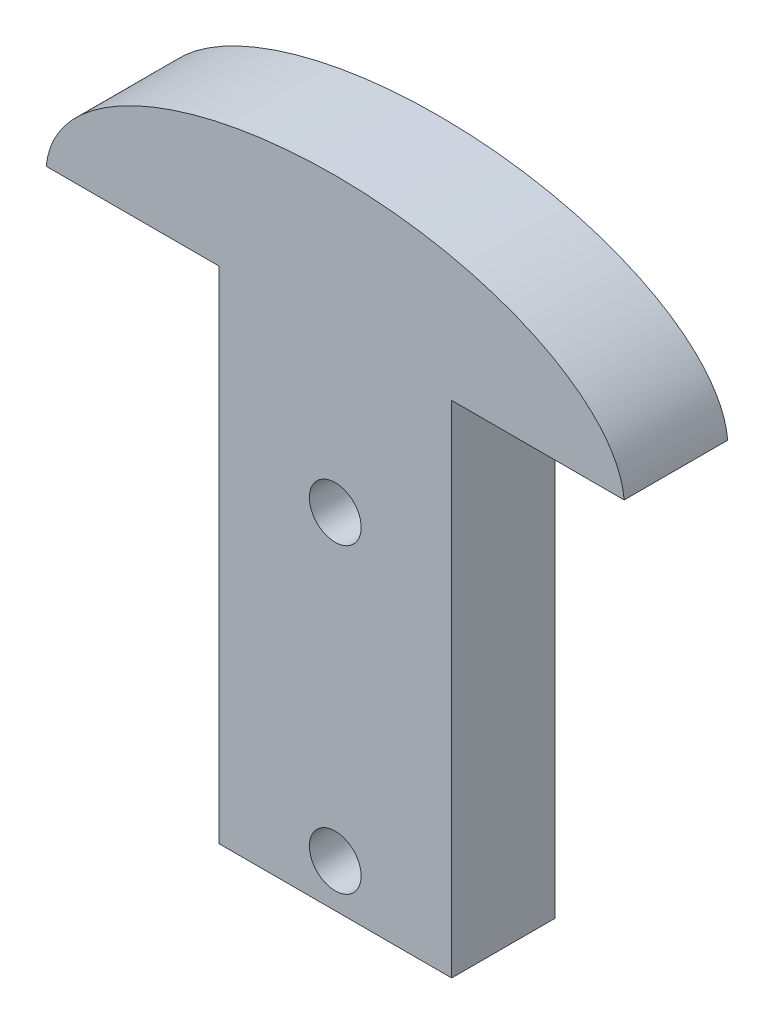
ISO-10303-21;
HEADER;
FILE_DESCRIPTION(('STEP AP214'),'2;1');
FILE_NAME('part.step','',(''),(''),'','','');
FILE_SCHEMA(('AUTOMOTIVE_DESIGN { 1 0 10303 214 1 1 1 1 }'));
ENDSEC;
DATA;
#1=APPLICATION_CONTEXT('core data for automotive mechanical design processes');
#2=APPLICATION_PROTOCOL_DEFINITION('international standard','automotive_design',2000,#1);
#3=PRODUCT_CONTEXT('',#1,'mechanical');
#4=PRODUCT('Part','Part','',(#3));
#5=PRODUCT_RELATED_PRODUCT_CATEGORY('part','',(#4));
#6=PRODUCT_DEFINITION_FORMATION('','',#4);
#7=PRODUCT_DEFINITION_CONTEXT('part definition',#1,'design');
#8=PRODUCT_DEFINITION('design','',#6,#7);
#9=PRODUCT_DEFINITION_SHAPE('','',#8);
#10=(LENGTH_UNIT() NAMED_UNIT(*) SI_UNIT(.MILLI.,.METRE.));
#11=(NAMED_UNIT(*) PLANE_ANGLE_UNIT() SI_UNIT($,.RADIAN.));
#12=(NAMED_UNIT(*) SI_UNIT($,.STERADIAN.) SOLID_ANGLE_UNIT());
#13=UNCERTAINTY_MEASURE_WITH_UNIT(LENGTH_MEASURE(1.E-05),#10,'distance_accuracy_value','');
#14=(GEOMETRIC_REPRESENTATION_CONTEXT(3) GLOBAL_UNCERTAINTY_ASSIGNED_CONTEXT((#13)) GLOBAL_UNIT_ASSIGNED_CONTEXT((#10,
#11,#12)) REPRESENTATION_CONTEXT('',''));
#15=CARTESIAN_POINT('',(0.,0.,0.));
#16=DIRECTION('',(0.,0.,1.));
#17=DIRECTION('',(1.,0.,0.));
#18=AXIS2_PLACEMENT_3D('',#15,#16,#17);
#19=CARTESIAN_POINT('',(-0.000203727926927351,14.3993493392085,6.));
#20=DIRECTION('',(0.,0.,1.));
#21=DIRECTION('',(1.,0.,0.));
#22=AXIS2_PLACEMENT_3D('',#19,#20,#21);
#23=PLANE('',#22);
#24=CARTESIAN_POINT('',(0.,-11.75,6.));
#25=DIRECTION('',(0.,0.,1.));
#26=DIRECTION('',(1.,0.,0.));
#27=AXIS2_PLACEMENT_3D('',#24,#25,#26);
#28=CIRCLE('',#27,1.5);
#29=CARTESIAN_POINT('',(1.5,-11.75,6.));
#30=VERTEX_POINT('',#29);
#31=EDGE_CURVE('E121',#30,#30,#28,.T.);
#32=ORIENTED_EDGE('',*,*,#31,.F.);
#33=EDGE_LOOP('',(#32));
#34=FACE_BOUND('',#33,.T.);
#35=DIRECTION('',(0.,1.,0.));
#36=VECTOR('',#35,1.);
#37=CARTESIAN_POINT('',(6.75,14.75,6.));
#38=LINE('',#37,#36);
#39=CARTESIAN_POINT('',(6.75,-14.25,6.));
#40=VERTEX_POINT('',#39);
#41=CARTESIAN_POINT('',(6.75,14.75,6.));
#42=VERTEX_POINT('',#41);
#43=EDGE_CURVE('E128',#40,#42,#38,.T.);
#44=ORIENTED_EDGE('',*,*,#43,.T.);
#45=DIRECTION('',(1.,0.,0.));
#46=VECTOR('',#45,1.);
#47=CARTESIAN_POINT('',(6.75,14.75,6.));
#48=LINE('',#47,#46);
#49=CARTESIAN_POINT('',(16.75,14.75,6.));
#50=VERTEX_POINT('',#49);
#51=EDGE_CURVE('E86',#42,#50,#48,.T.);
#52=ORIENTED_EDGE('',*,*,#51,.T.);
#53=CARTESIAN_POINT('',(-0.000203727926927351,14.3993493392085,6.));
#54=DIRECTION('',(0.,0.,1.));
#55=DIRECTION('',(0.999999982561685,0.000186752859981818,0.));
#56=AXIS2_PLACEMENT_3D('',#53,#54,#55);
#57=ELLIPSE('',#56,16.7650830503464,8.26853718862915);
#58=CARTESIAN_POINT('',(-16.75,14.75,6.));
#59=VERTEX_POINT('',#58);
#60=EDGE_CURVE('E99',#50,#59,#57,.T.);
#61=ORIENTED_EDGE('',*,*,#60,.T.);
#62=DIRECTION('',(1.,0.,0.));
#63=VECTOR('',#62,1.);
#64=CARTESIAN_POINT('',(-6.75,14.75,6.));
#65=LINE('',#64,#63);
#66=CARTESIAN_POINT('',(-6.75,14.75,6.));
#67=VERTEX_POINT('',#66);
#68=EDGE_CURVE('E93',#59,#67,#65,.T.);
#69=ORIENTED_EDGE('',*,*,#68,.T.);
#70=DIRECTION('',(0.,-1.,0.));
#71=VECTOR('',#70,1.);
#72=CARTESIAN_POINT('',(-6.75,14.75,6.));
#73=LINE('',#72,#71);
#74=CARTESIAN_POINT('',(-6.75,-14.25,6.));
#75=VERTEX_POINT('',#74);
#76=EDGE_CURVE('E97',#67,#75,#73,.T.);
#77=ORIENTED_EDGE('',*,*,#76,.T.);
#78=DIRECTION('',(1.,0.,0.));
#79=VECTOR('',#78,1.);
#80=CARTESIAN_POINT('',(-6.75,-14.25,6.));
#81=LINE('',#80,#79);
#82=EDGE_CURVE('E49',#75,#40,#81,.T.);
#83=ORIENTED_EDGE('',*,*,#82,.T.);
#84=EDGE_LOOP('',(#44,#52,#61,#69,#77,#83));
#85=FACE_BOUND('',#84,.T.);
#86=CARTESIAN_POINT('',(0.,5.75,6.));
#87=DIRECTION('',(0.,0.,1.));
#88=DIRECTION('',(1.,0.,0.));
#89=AXIS2_PLACEMENT_3D('',#86,#87,#88);
#90=CIRCLE('',#89,1.5);
#91=CARTESIAN_POINT('',(1.5,5.75,6.));
#92=VERTEX_POINT('',#91);
#93=EDGE_CURVE('E170',#92,#92,#90,.T.);
#94=ORIENTED_EDGE('',*,*,#93,.F.);
#95=EDGE_LOOP('',(#94));
#96=FACE_BOUND('',#95,.T.);
#97=ADVANCED_FACE('F32',(#34,#85,#96),#23,.T.);
#98=CARTESIAN_POINT('',(-0.000203727926927351,14.3993493392085,0.));
#99=DIRECTION('',(0.,0.,1.));
#100=DIRECTION('',(1.,0.,0.));
#101=AXIS2_PLACEMENT_3D('',#98,#99,#100);
#102=PLANE('',#101);
#103=DIRECTION('',(0.,1.,0.));
#104=VECTOR('',#103,1.);
#105=CARTESIAN_POINT('',(6.75,14.75,0.));
#106=LINE('',#105,#104);
#107=CARTESIAN_POINT('',(6.75,-14.25,0.));
#108=VERTEX_POINT('',#107);
#109=CARTESIAN_POINT('',(6.75,14.75,0.));
#110=VERTEX_POINT('',#109);
#111=EDGE_CURVE('E117',#108,#110,#106,.T.);
#112=ORIENTED_EDGE('',*,*,#111,.F.);
#113=DIRECTION('',(1.,0.,0.));
#114=VECTOR('',#113,1.);
#115=CARTESIAN_POINT('',(-6.75,-14.25,0.));
#116=LINE('',#115,#114);
#117=CARTESIAN_POINT('',(-6.75,-14.25,0.));
#118=VERTEX_POINT('',#117);
#119=EDGE_CURVE('E78',#118,#108,#116,.T.);
#120=ORIENTED_EDGE('',*,*,#119,.F.);
#121=DIRECTION('',(0.,-1.,0.));
#122=VECTOR('',#121,1.);
#123=CARTESIAN_POINT('',(-6.75,14.75,0.));
#124=LINE('',#123,#122);
#125=CARTESIAN_POINT('',(-6.75,14.75,0.));
#126=VERTEX_POINT('',#125);
#127=EDGE_CURVE('E72',#126,#118,#124,.T.);
#128=ORIENTED_EDGE('',*,*,#127,.F.);
#129=DIRECTION('',(1.,0.,0.));
#130=VECTOR('',#129,1.);
#131=CARTESIAN_POINT('',(-6.75,14.75,0.));
#132=LINE('',#131,#130);
#133=CARTESIAN_POINT('',(-16.75,14.75,0.));
#134=VERTEX_POINT('',#133);
#135=EDGE_CURVE('E107',#134,#126,#132,.T.);
#136=ORIENTED_EDGE('',*,*,#135,.F.);
#137=CARTESIAN_POINT('',(-0.000203727926927351,14.3993493392085,0.));
#138=DIRECTION('',(0.,0.,1.));
#139=DIRECTION('',(0.999999982561685,0.000186752859981818,0.));
#140=AXIS2_PLACEMENT_3D('',#137,#138,#139);
#141=ELLIPSE('',#140,16.7650830503464,8.26853718862915);
#142=CARTESIAN_POINT('',(16.75,14.75,0.));
#143=VERTEX_POINT('',#142);
#144=EDGE_CURVE('E123',#143,#134,#141,.T.);
#145=ORIENTED_EDGE('',*,*,#144,.F.);
#146=DIRECTION('',(1.,0.,0.));
#147=VECTOR('',#146,1.);
#148=CARTESIAN_POINT('',(6.75,14.75,0.));
#149=LINE('',#148,#147);
#150=EDGE_CURVE('E120',#110,#143,#149,.T.);
#151=ORIENTED_EDGE('',*,*,#150,.F.);
#152=EDGE_LOOP('',(#112,#120,#128,#136,#145,#151));
#153=FACE_BOUND('',#152,.T.);
#154=CARTESIAN_POINT('',(0.,-11.75,0.));
#155=DIRECTION('',(0.,0.,1.));
#156=DIRECTION('',(1.,0.,0.));
#157=AXIS2_PLACEMENT_3D('',#154,#155,#156);
#158=CIRCLE('',#157,1.5);
#159=CARTESIAN_POINT('',(1.5,-11.75,0.));
#160=VERTEX_POINT('',#159);
#161=EDGE_CURVE('E176',#160,#160,#158,.T.);
#162=ORIENTED_EDGE('',*,*,#161,.T.);
#163=EDGE_LOOP('',(#162));
#164=FACE_BOUND('',#163,.T.);
#165=CARTESIAN_POINT('',(0.,5.75,0.));
#166=DIRECTION('',(0.,0.,1.));
#167=DIRECTION('',(1.,0.,0.));
#168=AXIS2_PLACEMENT_3D('',#165,#166,#167);
#169=CIRCLE('',#168,1.5);
#170=CARTESIAN_POINT('',(1.5,5.75,0.));
#171=VERTEX_POINT('',#170);
#172=EDGE_CURVE('E173',#171,#171,#169,.T.);
#173=ORIENTED_EDGE('',*,*,#172,.T.);
#174=EDGE_LOOP('',(#173));
#175=FACE_BOUND('',#174,.T.);
#176=ADVANCED_FACE('F137',(#153,#164,#175),#102,.F.);
#177=CARTESIAN_POINT('',(6.75,14.75,6.));
#178=DIRECTION('',(-1.,0.,0.));
#179=DIRECTION('',(0.,-1.,0.));
#180=AXIS2_PLACEMENT_3D('',#177,#178,#179);
#181=PLANE('',#180);
#182=ORIENTED_EDGE('',*,*,#111,.T.);
#183=DIRECTION('',(0.,0.,-1.));
#184=VECTOR('',#183,1.);
#185=CARTESIAN_POINT('',(6.75,14.75,6.));
#186=LINE('',#185,#184);
#187=EDGE_CURVE('E11',#42,#110,#186,.T.);
#188=ORIENTED_EDGE('',*,*,#187,.F.);
#189=ORIENTED_EDGE('',*,*,#43,.F.);
#190=DIRECTION('',(0.,0.,-1.));
#191=VECTOR('',#190,1.);
#192=CARTESIAN_POINT('',(6.75,-14.25,6.));
#193=LINE('',#192,#191);
#194=EDGE_CURVE('E113',#40,#108,#193,.T.);
#195=ORIENTED_EDGE('',*,*,#194,.T.);
#196=EDGE_LOOP('',(#182,#188,#189,#195));
#197=FACE_BOUND('',#196,.T.);
#198=ADVANCED_FACE('F34',(#197),#181,.F.);
#199=CARTESIAN_POINT('',(6.75,14.75,6.));
#200=DIRECTION('',(0.,1.,0.));
#201=DIRECTION('',(-1.,0.,0.));
#202=AXIS2_PLACEMENT_3D('',#199,#200,#201);
#203=PLANE('',#202);
#204=ORIENTED_EDGE('',*,*,#150,.T.);
#205=DIRECTION('',(0.,0.,-1.));
#206=VECTOR('',#205,1.);
#207=CARTESIAN_POINT('',(16.75,14.75,6.));
#208=LINE('',#207,#206);
#209=EDGE_CURVE('E41',#50,#143,#208,.T.);
#210=ORIENTED_EDGE('',*,*,#209,.F.);
#211=ORIENTED_EDGE('',*,*,#51,.F.);
#212=ORIENTED_EDGE('',*,*,#187,.T.);
#213=EDGE_LOOP('',(#204,#210,#211,#212));
#214=FACE_BOUND('',#213,.T.);
#215=ADVANCED_FACE('F188',(#214),#203,.F.);
#216=DIRECTION('',(0.,0.,-1.));
#217=VECTOR('',#216,1.);
#218=SURFACE_OF_LINEAR_EXTRUSION('',#57,#217);
#219=ORIENTED_EDGE('',*,*,#144,.T.);
#220=DIRECTION('',(0.,0.,-1.));
#221=VECTOR('',#220,1.);
#222=CARTESIAN_POINT('',(-16.75,14.75,6.));
#223=LINE('',#222,#221);
#224=EDGE_CURVE('E108',#59,#134,#223,.T.);
#225=ORIENTED_EDGE('',*,*,#224,.F.);
#226=ORIENTED_EDGE('',*,*,#60,.F.);
#227=ORIENTED_EDGE('',*,*,#209,.T.);
#228=EDGE_LOOP('',(#219,#225,#226,#227));
#229=FACE_BOUND('',#228,.T.);
#230=ADVANCED_FACE('F134',(#229),#218,.F.);
#231=CARTESIAN_POINT('',(-6.75,14.75,6.));
#232=DIRECTION('',(0.,1.,0.));
#233=DIRECTION('',(-1.,0.,0.));
#234=AXIS2_PLACEMENT_3D('',#231,#232,#233);
#235=PLANE('',#234);
#236=ORIENTED_EDGE('',*,*,#135,.T.);
#237=DIRECTION('',(0.,0.,-1.));
#238=VECTOR('',#237,1.);
#239=CARTESIAN_POINT('',(-6.75,14.75,6.));
#240=LINE('',#239,#238);
#241=EDGE_CURVE('E104',#67,#126,#240,.T.);
#242=ORIENTED_EDGE('',*,*,#241,.F.);
#243=ORIENTED_EDGE('',*,*,#68,.F.);
#244=ORIENTED_EDGE('',*,*,#224,.T.);
#245=EDGE_LOOP('',(#236,#242,#243,#244));
#246=FACE_BOUND('',#245,.T.);
#247=ADVANCED_FACE('F105',(#246),#235,.F.);
#248=CARTESIAN_POINT('',(-6.75,14.75,6.));
#249=DIRECTION('',(1.,0.,0.));
#250=DIRECTION('',(0.,1.,0.));
#251=AXIS2_PLACEMENT_3D('',#248,#249,#250);
#252=PLANE('',#251);
#253=ORIENTED_EDGE('',*,*,#127,.T.);
#254=DIRECTION('',(0.,0.,-1.));
#255=VECTOR('',#254,1.);
#256=CARTESIAN_POINT('',(-6.75,-14.25,6.));
#257=LINE('',#256,#255);
#258=EDGE_CURVE('E109',#75,#118,#257,.T.);
#259=ORIENTED_EDGE('',*,*,#258,.F.);
#260=ORIENTED_EDGE('',*,*,#76,.F.);
#261=ORIENTED_EDGE('',*,*,#241,.T.);
#262=EDGE_LOOP('',(#253,#259,#260,#261));
#263=FACE_BOUND('',#262,.T.);
#264=ADVANCED_FACE('F111',(#263),#252,.F.);
#265=CARTESIAN_POINT('',(-6.75,-14.25,6.));
#266=DIRECTION('',(0.,1.,0.));
#267=DIRECTION('',(0.,0.,1.));
#268=AXIS2_PLACEMENT_3D('',#265,#266,#267);
#269=PLANE('',#268);
#270=ORIENTED_EDGE('',*,*,#119,.T.);
#271=ORIENTED_EDGE('',*,*,#194,.F.);
#272=ORIENTED_EDGE('',*,*,#82,.F.);
#273=ORIENTED_EDGE('',*,*,#258,.T.);
#274=EDGE_LOOP('',(#270,#271,#272,#273));
#275=FACE_BOUND('',#274,.T.);
#276=ADVANCED_FACE('F142',(#275),#269,.F.);
#277=CARTESIAN_POINT('',(0.,-11.75,6.));
#278=DIRECTION('',(0.,0.,-1.));
#279=DIRECTION('',(-1.,0.,0.));
#280=AXIS2_PLACEMENT_3D('',#277,#278,#279);
#281=CYLINDRICAL_SURFACE('',#280,1.5);
#282=ORIENTED_EDGE('',*,*,#31,.T.);
#283=EDGE_LOOP('',(#282));
#284=FACE_BOUND('',#283,.T.);
#285=ORIENTED_EDGE('',*,*,#161,.F.);
#286=EDGE_LOOP('',(#285));
#287=FACE_BOUND('',#286,.T.);
#288=ADVANCED_FACE('F144',(#284,#287),#281,.F.);
#289=CARTESIAN_POINT('',(0.,5.75,6.));
#290=DIRECTION('',(0.,0.,-1.));
#291=DIRECTION('',(-1.,0.,0.));
#292=AXIS2_PLACEMENT_3D('',#289,#290,#291);
#293=CYLINDRICAL_SURFACE('',#292,1.5);
#294=ORIENTED_EDGE('',*,*,#93,.T.);
#295=EDGE_LOOP('',(#294));
#296=FACE_BOUND('',#295,.T.);
#297=ORIENTED_EDGE('',*,*,#172,.F.);
#298=EDGE_LOOP('',(#297));
#299=FACE_BOUND('',#298,.T.);
#300=ADVANCED_FACE('F150',(#296,#299),#293,.F.);
#301=CLOSED_SHELL('',(#97,#176,#198,#215,#230,#247,#264,#276,#288,#300));
#302=MANIFOLD_SOLID_BREP('B2',#301);
#303=ADVANCED_BREP_SHAPE_REPRESENTATION('',(#18,#302),#14);
#304=SHAPE_DEFINITION_REPRESENTATION(#9,#303);
ENDSEC;
END-ISO-10303-21;
